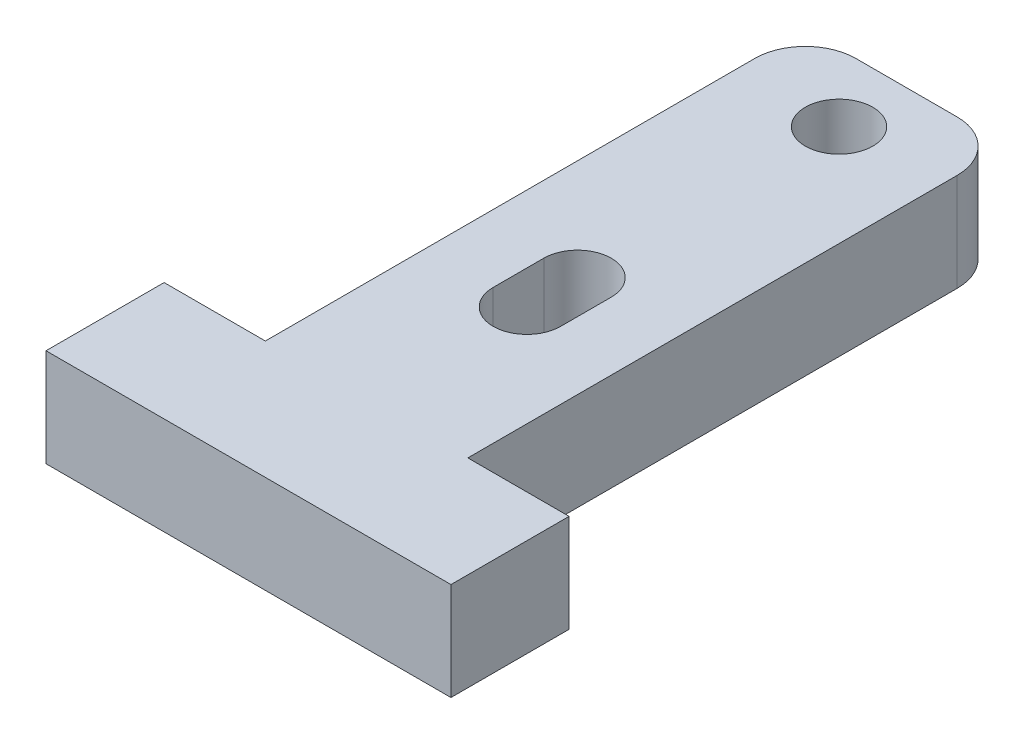
ISO-10303-21;
HEADER;
FILE_DESCRIPTION(('STEP AP214'),'2;1');
FILE_NAME('part.step','',(''),(''),'','','');
FILE_SCHEMA(('AUTOMOTIVE_DESIGN { 1 0 10303 214 1 1 1 1 }'));
ENDSEC;
DATA;
#1=APPLICATION_CONTEXT('core data for automotive mechanical design processes');
#2=APPLICATION_PROTOCOL_DEFINITION('international standard','automotive_design',2000,#1);
#3=PRODUCT_CONTEXT('',#1,'mechanical');
#4=PRODUCT('Part','Part','',(#3));
#5=PRODUCT_RELATED_PRODUCT_CATEGORY('part','',(#4));
#6=PRODUCT_DEFINITION_FORMATION('','',#4);
#7=PRODUCT_DEFINITION_CONTEXT('part definition',#1,'design');
#8=PRODUCT_DEFINITION('design','',#6,#7);
#9=PRODUCT_DEFINITION_SHAPE('','',#8);
#10=(LENGTH_UNIT() NAMED_UNIT(*) SI_UNIT(.MILLI.,.METRE.));
#11=(NAMED_UNIT(*) PLANE_ANGLE_UNIT() SI_UNIT($,.RADIAN.));
#12=(NAMED_UNIT(*) SI_UNIT($,.STERADIAN.) SOLID_ANGLE_UNIT());
#13=UNCERTAINTY_MEASURE_WITH_UNIT(LENGTH_MEASURE(1.E-05),#10,'distance_accuracy_value','');
#14=(GEOMETRIC_REPRESENTATION_CONTEXT(3) GLOBAL_UNCERTAINTY_ASSIGNED_CONTEXT((#13)) GLOBAL_UNIT_ASSIGNED_CONTEXT((#10,
#11,#12)) REPRESENTATION_CONTEXT('',''));
#15=CARTESIAN_POINT('',(0.,0.,0.));
#16=DIRECTION('',(0.,0.,1.));
#17=DIRECTION('',(1.,0.,0.));
#18=AXIS2_PLACEMENT_3D('',#15,#16,#17);
#19=CARTESIAN_POINT('',(-3.,5.8,-10.3755760873891));
#20=DIRECTION('',(0.,1.,0.));
#21=DIRECTION('',(0.,0.,1.));
#22=AXIS2_PLACEMENT_3D('',#19,#20,#21);
#23=PLANE('',#22);
#24=DIRECTION('',(0.,0.,-1.));
#25=VECTOR('',#24,1.);
#26=CARTESIAN_POINT('',(5.99999999999999,5.8,-10.3755760873891));
#27=LINE('',#26,#25);
#28=CARTESIAN_POINT('',(6.,5.8,18.6244239126108));
#29=VERTEX_POINT('',#28);
#30=CARTESIAN_POINT('',(5.99999999999999,5.8,-10.3755760873891));
#31=VERTEX_POINT('',#30);
#32=EDGE_CURVE('E181',#29,#31,#27,.T.);
#33=ORIENTED_EDGE('',*,*,#32,.T.);
#34=CARTESIAN_POINT('',(2.99999999999999,5.8,-10.3755760873891));
#35=DIRECTION('',(0.,1.,0.));
#36=DIRECTION('',(0.,0.,-1.));
#37=AXIS2_PLACEMENT_3D('',#34,#35,#36);
#38=CIRCLE('',#37,3.);
#39=CARTESIAN_POINT('',(2.99999999999999,5.8,-13.3755760873892));
#40=VERTEX_POINT('',#39);
#41=EDGE_CURVE('E184',#31,#40,#38,.T.);
#42=ORIENTED_EDGE('',*,*,#41,.T.);
#43=DIRECTION('',(-1.,0.,0.));
#44=VECTOR('',#43,1.);
#45=CARTESIAN_POINT('',(-3.,5.8,-13.3755760873891));
#46=LINE('',#45,#44);
#47=CARTESIAN_POINT('',(-3.,5.8,-13.3755760873891));
#48=VERTEX_POINT('',#47);
#49=EDGE_CURVE('E187',#40,#48,#46,.T.);
#50=ORIENTED_EDGE('',*,*,#49,.T.);
#51=CARTESIAN_POINT('',(-3.,5.8,-10.3755760873891));
#52=DIRECTION('',(0.,1.,0.));
#53=DIRECTION('',(0.,0.,1.));
#54=AXIS2_PLACEMENT_3D('',#51,#52,#53);
#55=CIRCLE('',#54,3.);
#56=CARTESIAN_POINT('',(-6.,5.8,-10.3755760873891));
#57=VERTEX_POINT('',#56);
#58=EDGE_CURVE('E189',#48,#57,#55,.T.);
#59=ORIENTED_EDGE('',*,*,#58,.T.);
#60=DIRECTION('',(0.,0.,1.));
#61=VECTOR('',#60,1.);
#62=CARTESIAN_POINT('',(-6.,5.8,-10.3755760873891));
#63=LINE('',#62,#61);
#64=CARTESIAN_POINT('',(-6.,5.8,18.6244239126108));
#65=VERTEX_POINT('',#64);
#66=EDGE_CURVE('E191',#57,#65,#63,.T.);
#67=ORIENTED_EDGE('',*,*,#66,.T.);
#68=DIRECTION('',(-1.,0.,0.));
#69=VECTOR('',#68,1.);
#70=CARTESIAN_POINT('',(-12.,5.8,18.6244239126108));
#71=LINE('',#70,#69);
#72=CARTESIAN_POINT('',(-12.,5.8,18.6244239126108));
#73=VERTEX_POINT('',#72);
#74=EDGE_CURVE('E193',#65,#73,#71,.T.);
#75=ORIENTED_EDGE('',*,*,#74,.T.);
#76=DIRECTION('',(0.,0.,1.));
#77=VECTOR('',#76,1.);
#78=CARTESIAN_POINT('',(-12.,5.8,18.6244239126108));
#79=LINE('',#78,#77);
#80=CARTESIAN_POINT('',(-12.,5.8,25.6244239126109));
#81=VERTEX_POINT('',#80);
#82=EDGE_CURVE('E195',#73,#81,#79,.T.);
#83=ORIENTED_EDGE('',*,*,#82,.T.);
#84=DIRECTION('',(1.,0.,0.));
#85=VECTOR('',#84,1.);
#86=CARTESIAN_POINT('',(-12.,5.8,25.6244239126109));
#87=LINE('',#86,#85);
#88=CARTESIAN_POINT('',(12.,5.8,25.6244239126108));
#89=VERTEX_POINT('',#88);
#90=EDGE_CURVE('E197',#81,#89,#87,.T.);
#91=ORIENTED_EDGE('',*,*,#90,.T.);
#92=DIRECTION('',(0.,0.,-1.));
#93=VECTOR('',#92,1.);
#94=CARTESIAN_POINT('',(12.,5.8,18.6244239126108));
#95=LINE('',#94,#93);
#96=CARTESIAN_POINT('',(12.,5.8,18.6244239126108));
#97=VERTEX_POINT('',#96);
#98=EDGE_CURVE('E199',#89,#97,#95,.T.);
#99=ORIENTED_EDGE('',*,*,#98,.T.);
#100=DIRECTION('',(-1.,0.,0.));
#101=VECTOR('',#100,1.);
#102=CARTESIAN_POINT('',(6.,5.8,18.6244239126108));
#103=LINE('',#102,#101);
#104=EDGE_CURVE('E201',#97,#29,#103,.T.);
#105=ORIENTED_EDGE('',*,*,#104,.T.);
#106=EDGE_LOOP('',(#33,#42,#50,#59,#67,#75,#83,#91,#99,#105));
#107=FACE_BOUND('',#106,.T.);
#108=CARTESIAN_POINT('',(0.,5.8,-9.37557608738915));
#109=DIRECTION('',(0.,1.,0.));
#110=DIRECTION('',(0.,0.,1.));
#111=AXIS2_PLACEMENT_3D('',#108,#109,#110);
#112=CIRCLE('',#111,2.);
#113=CARTESIAN_POINT('',(0.,5.8,-7.37557608738915));
#114=VERTEX_POINT('',#113);
#115=EDGE_CURVE('E175',#114,#114,#112,.T.);
#116=ORIENTED_EDGE('',*,*,#115,.F.);
#117=EDGE_LOOP('',(#116));
#118=FACE_BOUND('',#117,.T.);
#119=DIRECTION('',(0.,0.,-1.));
#120=VECTOR('',#119,1.);
#121=CARTESIAN_POINT('',(2.,5.8,9.12442391261085));
#122=LINE('',#121,#120);
#123=CARTESIAN_POINT('',(2.,5.8,9.12442391261085));
#124=VERTEX_POINT('',#123);
#125=CARTESIAN_POINT('',(2.,5.8,6.12442391261085));
#126=VERTEX_POINT('',#125);
#127=EDGE_CURVE('E147',#124,#126,#122,.T.);
#128=ORIENTED_EDGE('',*,*,#127,.F.);
#129=CARTESIAN_POINT('',(0.,5.8,9.12442391261085));
#130=DIRECTION('',(0.,1.,0.));
#131=DIRECTION('',(0.,0.,1.));
#132=AXIS2_PLACEMENT_3D('',#129,#130,#131);
#133=CIRCLE('',#132,2.);
#134=CARTESIAN_POINT('',(-2.,5.8,9.12442391261085));
#135=VERTEX_POINT('',#134);
#136=EDGE_CURVE('E139',#135,#124,#133,.T.);
#137=ORIENTED_EDGE('',*,*,#136,.F.);
#138=DIRECTION('',(0.,0.,1.));
#139=VECTOR('',#138,1.);
#140=CARTESIAN_POINT('',(-2.,5.8,9.12442391261085));
#141=LINE('',#140,#139);
#142=CARTESIAN_POINT('',(-2.,5.8,6.12442391261085));
#143=VERTEX_POINT('',#142);
#144=EDGE_CURVE('E161',#143,#135,#141,.T.);
#145=ORIENTED_EDGE('',*,*,#144,.F.);
#146=CARTESIAN_POINT('',(0.,5.8,6.12442391261085));
#147=DIRECTION('',(0.,1.,0.));
#148=DIRECTION('',(0.,0.,1.));
#149=AXIS2_PLACEMENT_3D('',#146,#147,#148);
#150=CIRCLE('',#149,2.);
#151=EDGE_CURVE('E159',#126,#143,#150,.T.);
#152=ORIENTED_EDGE('',*,*,#151,.F.);
#153=EDGE_LOOP('',(#128,#137,#145,#152));
#154=FACE_BOUND('',#153,.T.);
#155=ADVANCED_FACE('F38',(#107,#118,#154),#23,.T.);
#156=CARTESIAN_POINT('',(-3.,0.,-10.3755760873891));
#157=DIRECTION('',(0.,1.,0.));
#158=DIRECTION('',(0.,0.,1.));
#159=AXIS2_PLACEMENT_3D('',#156,#157,#158);
#160=PLANE('',#159);
#161=CARTESIAN_POINT('',(0.,0.,-9.37557608738915));
#162=DIRECTION('',(0.,1.,0.));
#163=DIRECTION('',(0.,0.,1.));
#164=AXIS2_PLACEMENT_3D('',#161,#162,#163);
#165=CIRCLE('',#164,2.);
#166=CARTESIAN_POINT('',(0.,0.,-7.37557608738915));
#167=VERTEX_POINT('',#166);
#168=EDGE_CURVE('E155',#167,#167,#165,.T.);
#169=ORIENTED_EDGE('',*,*,#168,.T.);
#170=EDGE_LOOP('',(#169));
#171=FACE_BOUND('',#170,.T.);
#172=DIRECTION('',(0.,0.,-1.));
#173=VECTOR('',#172,1.);
#174=CARTESIAN_POINT('',(5.99999999999999,0.,-10.3755760873891));
#175=LINE('',#174,#173);
#176=CARTESIAN_POINT('',(6.,0.,18.6244239126108));
#177=VERTEX_POINT('',#176);
#178=CARTESIAN_POINT('',(5.99999999999999,0.,-10.3755760873891));
#179=VERTEX_POINT('',#178);
#180=EDGE_CURVE('E178',#177,#179,#175,.T.);
#181=ORIENTED_EDGE('',*,*,#180,.F.);
#182=DIRECTION('',(-1.,0.,0.));
#183=VECTOR('',#182,1.);
#184=CARTESIAN_POINT('',(6.,0.,18.6244239126108));
#185=LINE('',#184,#183);
#186=CARTESIAN_POINT('',(12.,0.,18.6244239126108));
#187=VERTEX_POINT('',#186);
#188=EDGE_CURVE('E185',#187,#177,#185,.T.);
#189=ORIENTED_EDGE('',*,*,#188,.F.);
#190=DIRECTION('',(0.,0.,-1.));
#191=VECTOR('',#190,1.);
#192=CARTESIAN_POINT('',(12.,0.,18.6244239126108));
#193=LINE('',#192,#191);
#194=CARTESIAN_POINT('',(12.,0.,25.6244239126108));
#195=VERTEX_POINT('',#194);
#196=EDGE_CURVE('E220',#195,#187,#193,.T.);
#197=ORIENTED_EDGE('',*,*,#196,.F.);
#198=DIRECTION('',(1.,0.,0.));
#199=VECTOR('',#198,1.);
#200=CARTESIAN_POINT('',(-12.,0.,25.6244239126109));
#201=LINE('',#200,#199);
#202=CARTESIAN_POINT('',(-12.,0.,25.6244239126109));
#203=VERTEX_POINT('',#202);
#204=EDGE_CURVE('E218',#203,#195,#201,.T.);
#205=ORIENTED_EDGE('',*,*,#204,.F.);
#206=DIRECTION('',(0.,0.,1.));
#207=VECTOR('',#206,1.);
#208=CARTESIAN_POINT('',(-12.,0.,18.6244239126108));
#209=LINE('',#208,#207);
#210=CARTESIAN_POINT('',(-12.,0.,18.6244239126108));
#211=VERTEX_POINT('',#210);
#212=EDGE_CURVE('E216',#211,#203,#209,.T.);
#213=ORIENTED_EDGE('',*,*,#212,.F.);
#214=DIRECTION('',(-1.,0.,0.));
#215=VECTOR('',#214,1.);
#216=CARTESIAN_POINT('',(-12.,0.,18.6244239126108));
#217=LINE('',#216,#215);
#218=CARTESIAN_POINT('',(-6.,0.,18.6244239126108));
#219=VERTEX_POINT('',#218);
#220=EDGE_CURVE('E214',#219,#211,#217,.T.);
#221=ORIENTED_EDGE('',*,*,#220,.F.);
#222=DIRECTION('',(0.,0.,1.));
#223=VECTOR('',#222,1.);
#224=CARTESIAN_POINT('',(-6.,0.,-10.3755760873891));
#225=LINE('',#224,#223);
#226=CARTESIAN_POINT('',(-6.,0.,-10.3755760873891));
#227=VERTEX_POINT('',#226);
#228=EDGE_CURVE('E212',#227,#219,#225,.T.);
#229=ORIENTED_EDGE('',*,*,#228,.F.);
#230=CARTESIAN_POINT('',(-3.,0.,-10.3755760873891));
#231=DIRECTION('',(0.,1.,0.));
#232=DIRECTION('',(0.,0.,1.));
#233=AXIS2_PLACEMENT_3D('',#230,#231,#232);
#234=CIRCLE('',#233,3.);
#235=CARTESIAN_POINT('',(-3.,0.,-13.3755760873891));
#236=VERTEX_POINT('',#235);
#237=EDGE_CURVE('E210',#236,#227,#234,.T.);
#238=ORIENTED_EDGE('',*,*,#237,.F.);
#239=DIRECTION('',(-1.,0.,0.));
#240=VECTOR('',#239,1.);
#241=CARTESIAN_POINT('',(-3.,0.,-13.3755760873891));
#242=LINE('',#241,#240);
#243=CARTESIAN_POINT('',(2.99999999999999,0.,-13.3755760873892));
#244=VERTEX_POINT('',#243);
#245=EDGE_CURVE('E208',#244,#236,#242,.T.);
#246=ORIENTED_EDGE('',*,*,#245,.F.);
#247=CARTESIAN_POINT('',(2.99999999999999,0.,-10.3755760873891));
#248=DIRECTION('',(0.,1.,0.));
#249=DIRECTION('',(0.,0.,-1.));
#250=AXIS2_PLACEMENT_3D('',#247,#248,#249);
#251=CIRCLE('',#250,3.);
#252=EDGE_CURVE('E206',#179,#244,#251,.T.);
#253=ORIENTED_EDGE('',*,*,#252,.F.);
#254=EDGE_LOOP('',(#181,#189,#197,#205,#213,#221,#229,#238,#246,#253));
#255=FACE_BOUND('',#254,.T.);
#256=CARTESIAN_POINT('',(0.,0.,9.12442391261085));
#257=DIRECTION('',(0.,1.,0.));
#258=DIRECTION('',(0.,0.,1.));
#259=AXIS2_PLACEMENT_3D('',#256,#257,#258);
#260=CIRCLE('',#259,2.);
#261=CARTESIAN_POINT('',(-2.,0.,9.12442391261085));
#262=VERTEX_POINT('',#261);
#263=CARTESIAN_POINT('',(2.,0.,9.12442391261085));
#264=VERTEX_POINT('',#263);
#265=EDGE_CURVE('E61',#262,#264,#260,.T.);
#266=ORIENTED_EDGE('',*,*,#265,.T.);
#267=DIRECTION('',(0.,0.,-1.));
#268=VECTOR('',#267,1.);
#269=CARTESIAN_POINT('',(2.,0.,9.12442391261085));
#270=LINE('',#269,#268);
#271=CARTESIAN_POINT('',(2.,0.,6.12442391261085));
#272=VERTEX_POINT('',#271);
#273=EDGE_CURVE('E154',#264,#272,#270,.T.);
#274=ORIENTED_EDGE('',*,*,#273,.T.);
#275=CARTESIAN_POINT('',(0.,0.,6.12442391261085));
#276=DIRECTION('',(0.,1.,0.));
#277=DIRECTION('',(0.,0.,1.));
#278=AXIS2_PLACEMENT_3D('',#275,#276,#277);
#279=CIRCLE('',#278,2.);
#280=CARTESIAN_POINT('',(-2.,0.,6.12442391261085));
#281=VERTEX_POINT('',#280);
#282=EDGE_CURVE('E167',#272,#281,#279,.T.);
#283=ORIENTED_EDGE('',*,*,#282,.T.);
#284=DIRECTION('',(0.,0.,1.));
#285=VECTOR('',#284,1.);
#286=CARTESIAN_POINT('',(-2.,0.,9.12442391261085));
#287=LINE('',#286,#285);
#288=EDGE_CURVE('E148',#281,#262,#287,.T.);
#289=ORIENTED_EDGE('',*,*,#288,.T.);
#290=EDGE_LOOP('',(#266,#274,#283,#289));
#291=FACE_BOUND('',#290,.T.);
#292=ADVANCED_FACE('F256',(#171,#255,#291),#160,.F.);
#293=CARTESIAN_POINT('',(5.99999999999999,5.8,-10.3755760873891));
#294=DIRECTION('',(-1.,0.,0.));
#295=DIRECTION('',(0.,0.,1.));
#296=AXIS2_PLACEMENT_3D('',#293,#294,#295);
#297=PLANE('',#296);
#298=ORIENTED_EDGE('',*,*,#180,.T.);
#299=DIRECTION('',(0.,-1.,0.));
#300=VECTOR('',#299,1.);
#301=CARTESIAN_POINT('',(5.99999999999999,5.8,-10.3755760873891));
#302=LINE('',#301,#300);
#303=EDGE_CURVE('E11',#31,#179,#302,.T.);
#304=ORIENTED_EDGE('',*,*,#303,.F.);
#305=ORIENTED_EDGE('',*,*,#32,.F.);
#306=DIRECTION('',(0.,-1.,0.));
#307=VECTOR('',#306,1.);
#308=CARTESIAN_POINT('',(6.,5.8,18.6244239126108));
#309=LINE('',#308,#307);
#310=EDGE_CURVE('E203',#29,#177,#309,.T.);
#311=ORIENTED_EDGE('',*,*,#310,.T.);
#312=EDGE_LOOP('',(#298,#304,#305,#311));
#313=FACE_BOUND('',#312,.T.);
#314=ADVANCED_FACE('F40',(#313),#297,.F.);
#315=CARTESIAN_POINT('',(2.99999999999999,5.8,-10.3755760873891));
#316=DIRECTION('',(0.,-1.,0.));
#317=DIRECTION('',(0.,0.,-1.));
#318=AXIS2_PLACEMENT_3D('',#315,#316,#317);
#319=CYLINDRICAL_SURFACE('',#318,3.);
#320=ORIENTED_EDGE('',*,*,#252,.T.);
#321=DIRECTION('',(0.,-1.,0.));
#322=VECTOR('',#321,1.);
#323=CARTESIAN_POINT('',(2.99999999999999,5.8,-13.3755760873892));
#324=LINE('',#323,#322);
#325=EDGE_CURVE('E46',#40,#244,#324,.T.);
#326=ORIENTED_EDGE('',*,*,#325,.F.);
#327=ORIENTED_EDGE('',*,*,#41,.F.);
#328=ORIENTED_EDGE('',*,*,#303,.T.);
#329=EDGE_LOOP('',(#320,#326,#327,#328));
#330=FACE_BOUND('',#329,.T.);
#331=ADVANCED_FACE('F274',(#330),#319,.T.);
#332=CARTESIAN_POINT('',(-3.,5.8,-13.3755760873891));
#333=DIRECTION('',(0.,0.,1.));
#334=DIRECTION('',(1.,0.,0.));
#335=AXIS2_PLACEMENT_3D('',#332,#333,#334);
#336=PLANE('',#335);
#337=ORIENTED_EDGE('',*,*,#245,.T.);
#338=DIRECTION('',(0.,-1.,0.));
#339=VECTOR('',#338,1.);
#340=CARTESIAN_POINT('',(-3.,5.8,-13.3755760873891));
#341=LINE('',#340,#339);
#342=EDGE_CURVE('E243',#48,#236,#341,.T.);
#343=ORIENTED_EDGE('',*,*,#342,.F.);
#344=ORIENTED_EDGE('',*,*,#49,.F.);
#345=ORIENTED_EDGE('',*,*,#325,.T.);
#346=EDGE_LOOP('',(#337,#343,#344,#345));
#347=FACE_BOUND('',#346,.T.);
#348=ADVANCED_FACE('F250',(#347),#336,.F.);
#349=CARTESIAN_POINT('',(-3.,5.8,-10.3755760873891));
#350=DIRECTION('',(0.,-1.,0.));
#351=DIRECTION('',(0.,0.,-1.));
#352=AXIS2_PLACEMENT_3D('',#349,#350,#351);
#353=CYLINDRICAL_SURFACE('',#352,3.);
#354=ORIENTED_EDGE('',*,*,#237,.T.);
#355=DIRECTION('',(0.,-1.,0.));
#356=VECTOR('',#355,1.);
#357=CARTESIAN_POINT('',(-6.,5.8,-10.3755760873891));
#358=LINE('',#357,#356);
#359=EDGE_CURVE('E240',#57,#227,#358,.T.);
#360=ORIENTED_EDGE('',*,*,#359,.F.);
#361=ORIENTED_EDGE('',*,*,#58,.F.);
#362=ORIENTED_EDGE('',*,*,#342,.T.);
#363=EDGE_LOOP('',(#354,#360,#361,#362));
#364=FACE_BOUND('',#363,.T.);
#365=ADVANCED_FACE('F262',(#364),#353,.T.);
#366=CARTESIAN_POINT('',(-6.,5.8,-10.3755760873891));
#367=DIRECTION('',(1.,0.,0.));
#368=DIRECTION('',(0.,0.,-1.));
#369=AXIS2_PLACEMENT_3D('',#366,#367,#368);
#370=PLANE('',#369);
#371=ORIENTED_EDGE('',*,*,#228,.T.);
#372=DIRECTION('',(0.,-1.,0.));
#373=VECTOR('',#372,1.);
#374=CARTESIAN_POINT('',(-6.,5.8,18.6244239126108));
#375=LINE('',#374,#373);
#376=EDGE_CURVE('E237',#65,#219,#375,.T.);
#377=ORIENTED_EDGE('',*,*,#376,.F.);
#378=ORIENTED_EDGE('',*,*,#66,.F.);
#379=ORIENTED_EDGE('',*,*,#359,.T.);
#380=EDGE_LOOP('',(#371,#377,#378,#379));
#381=FACE_BOUND('',#380,.T.);
#382=ADVANCED_FACE('F266',(#381),#370,.F.);
#383=CARTESIAN_POINT('',(-12.,5.8,18.6244239126108));
#384=DIRECTION('',(0.,0.,1.));
#385=DIRECTION('',(1.,0.,0.));
#386=AXIS2_PLACEMENT_3D('',#383,#384,#385);
#387=PLANE('',#386);
#388=ORIENTED_EDGE('',*,*,#220,.T.);
#389=DIRECTION('',(0.,-1.,0.));
#390=VECTOR('',#389,1.);
#391=CARTESIAN_POINT('',(-12.,5.8,18.6244239126108));
#392=LINE('',#391,#390);
#393=EDGE_CURVE('E234',#73,#211,#392,.T.);
#394=ORIENTED_EDGE('',*,*,#393,.F.);
#395=ORIENTED_EDGE('',*,*,#74,.F.);
#396=ORIENTED_EDGE('',*,*,#376,.T.);
#397=EDGE_LOOP('',(#388,#394,#395,#396));
#398=FACE_BOUND('',#397,.T.);
#399=ADVANCED_FACE('F297',(#398),#387,.F.);
#400=CARTESIAN_POINT('',(-12.,5.8,18.6244239126108));
#401=DIRECTION('',(1.,0.,0.));
#402=DIRECTION('',(0.,0.,-1.));
#403=AXIS2_PLACEMENT_3D('',#400,#401,#402);
#404=PLANE('',#403);
#405=ORIENTED_EDGE('',*,*,#212,.T.);
#406=DIRECTION('',(0.,-1.,0.));
#407=VECTOR('',#406,1.);
#408=CARTESIAN_POINT('',(-12.,5.8,25.6244239126109));
#409=LINE('',#408,#407);
#410=EDGE_CURVE('E231',#81,#203,#409,.T.);
#411=ORIENTED_EDGE('',*,*,#410,.F.);
#412=ORIENTED_EDGE('',*,*,#82,.F.);
#413=ORIENTED_EDGE('',*,*,#393,.T.);
#414=EDGE_LOOP('',(#405,#411,#412,#413));
#415=FACE_BOUND('',#414,.T.);
#416=ADVANCED_FACE('F294',(#415),#404,.F.);
#417=CARTESIAN_POINT('',(-12.,5.8,25.6244239126109));
#418=DIRECTION('',(0.,0.,-1.));
#419=DIRECTION('',(-1.,0.,0.));
#420=AXIS2_PLACEMENT_3D('',#417,#418,#419);
#421=PLANE('',#420);
#422=ORIENTED_EDGE('',*,*,#204,.T.);
#423=DIRECTION('',(0.,-1.,0.));
#424=VECTOR('',#423,1.);
#425=CARTESIAN_POINT('',(12.,5.8,25.6244239126108));
#426=LINE('',#425,#424);
#427=EDGE_CURVE('E228',#89,#195,#426,.T.);
#428=ORIENTED_EDGE('',*,*,#427,.F.);
#429=ORIENTED_EDGE('',*,*,#90,.F.);
#430=ORIENTED_EDGE('',*,*,#410,.T.);
#431=EDGE_LOOP('',(#422,#428,#429,#430));
#432=FACE_BOUND('',#431,.T.);
#433=ADVANCED_FACE('F290',(#432),#421,.F.);
#434=CARTESIAN_POINT('',(12.,5.8,18.6244239126108));
#435=DIRECTION('',(-1.,0.,0.));
#436=DIRECTION('',(0.,0.,1.));
#437=AXIS2_PLACEMENT_3D('',#434,#435,#436);
#438=PLANE('',#437);
#439=ORIENTED_EDGE('',*,*,#196,.T.);
#440=DIRECTION('',(0.,-1.,0.));
#441=VECTOR('',#440,1.);
#442=CARTESIAN_POINT('',(12.,5.8,18.6244239126108));
#443=LINE('',#442,#441);
#444=EDGE_CURVE('E225',#97,#187,#443,.T.);
#445=ORIENTED_EDGE('',*,*,#444,.F.);
#446=ORIENTED_EDGE('',*,*,#98,.F.);
#447=ORIENTED_EDGE('',*,*,#427,.T.);
#448=EDGE_LOOP('',(#439,#445,#446,#447));
#449=FACE_BOUND('',#448,.T.);
#450=ADVANCED_FACE('F286',(#449),#438,.F.);
#451=CARTESIAN_POINT('',(6.,5.8,18.6244239126108));
#452=DIRECTION('',(0.,0.,1.));
#453=DIRECTION('',(1.,0.,0.));
#454=AXIS2_PLACEMENT_3D('',#451,#452,#453);
#455=PLANE('',#454);
#456=ORIENTED_EDGE('',*,*,#188,.T.);
#457=ORIENTED_EDGE('',*,*,#310,.F.);
#458=ORIENTED_EDGE('',*,*,#104,.F.);
#459=ORIENTED_EDGE('',*,*,#444,.T.);
#460=EDGE_LOOP('',(#456,#457,#458,#459));
#461=FACE_BOUND('',#460,.T.);
#462=ADVANCED_FACE('F281',(#461),#455,.F.);
#463=CARTESIAN_POINT('',(0.,5.8,-9.37557608738915));
#464=DIRECTION('',(0.,-1.,0.));
#465=DIRECTION('',(0.,0.,-1.));
#466=AXIS2_PLACEMENT_3D('',#463,#464,#465);
#467=CYLINDRICAL_SURFACE('',#466,2.);
#468=ORIENTED_EDGE('',*,*,#115,.T.);
#469=EDGE_LOOP('',(#468));
#470=FACE_BOUND('',#469,.T.);
#471=ORIENTED_EDGE('',*,*,#168,.F.);
#472=EDGE_LOOP('',(#471));
#473=FACE_BOUND('',#472,.T.);
#474=ADVANCED_FACE('F314',(#470,#473),#467,.F.);
#475=CARTESIAN_POINT('',(0.,5.8,9.12442391261085));
#476=DIRECTION('',(0.,-1.,0.));
#477=DIRECTION('',(0.,0.,-1.));
#478=AXIS2_PLACEMENT_3D('',#475,#476,#477);
#479=CYLINDRICAL_SURFACE('',#478,2.);
#480=ORIENTED_EDGE('',*,*,#265,.F.);
#481=DIRECTION('',(0.,-1.,0.));
#482=VECTOR('',#481,1.);
#483=CARTESIAN_POINT('',(-2.,5.8,9.12442391261085));
#484=LINE('',#483,#482);
#485=EDGE_CURVE('E143',#135,#262,#484,.T.);
#486=ORIENTED_EDGE('',*,*,#485,.F.);
#487=ORIENTED_EDGE('',*,*,#136,.T.);
#488=DIRECTION('',(0.,-1.,0.));
#489=VECTOR('',#488,1.);
#490=CARTESIAN_POINT('',(2.,5.8,9.12442391261085));
#491=LINE('',#490,#489);
#492=EDGE_CURVE('E142',#124,#264,#491,.T.);
#493=ORIENTED_EDGE('',*,*,#492,.T.);
#494=EDGE_LOOP('',(#480,#486,#487,#493));
#495=FACE_BOUND('',#494,.T.);
#496=ADVANCED_FACE('F141',(#495),#479,.F.);
#497=CARTESIAN_POINT('',(2.,5.8,9.12442391261085));
#498=DIRECTION('',(-1.,0.,0.));
#499=DIRECTION('',(0.,0.,1.));
#500=AXIS2_PLACEMENT_3D('',#497,#498,#499);
#501=PLANE('',#500);
#502=ORIENTED_EDGE('',*,*,#273,.F.);
#503=ORIENTED_EDGE('',*,*,#492,.F.);
#504=ORIENTED_EDGE('',*,*,#127,.T.);
#505=DIRECTION('',(0.,-1.,0.));
#506=VECTOR('',#505,1.);
#507=CARTESIAN_POINT('',(2.,5.8,6.12442391261085));
#508=LINE('',#507,#506);
#509=EDGE_CURVE('E156',#126,#272,#508,.T.);
#510=ORIENTED_EDGE('',*,*,#509,.T.);
#511=EDGE_LOOP('',(#502,#503,#504,#510));
#512=FACE_BOUND('',#511,.T.);
#513=ADVANCED_FACE('F151',(#512),#501,.T.);
#514=CARTESIAN_POINT('',(0.,5.8,6.12442391261085));
#515=DIRECTION('',(0.,-1.,0.));
#516=DIRECTION('',(0.,0.,-1.));
#517=AXIS2_PLACEMENT_3D('',#514,#515,#516);
#518=CYLINDRICAL_SURFACE('',#517,2.);
#519=ORIENTED_EDGE('',*,*,#282,.F.);
#520=ORIENTED_EDGE('',*,*,#509,.F.);
#521=ORIENTED_EDGE('',*,*,#151,.T.);
#522=DIRECTION('',(0.,-1.,0.));
#523=VECTOR('',#522,1.);
#524=CARTESIAN_POINT('',(-2.,5.8,6.12442391261085));
#525=LINE('',#524,#523);
#526=EDGE_CURVE('E53',#143,#281,#525,.T.);
#527=ORIENTED_EDGE('',*,*,#526,.T.);
#528=EDGE_LOOP('',(#519,#520,#521,#527));
#529=FACE_BOUND('',#528,.T.);
#530=ADVANCED_FACE('F351',(#529),#518,.F.);
#531=CARTESIAN_POINT('',(-2.,5.8,9.12442391261085));
#532=DIRECTION('',(1.,0.,0.));
#533=DIRECTION('',(0.,0.,-1.));
#534=AXIS2_PLACEMENT_3D('',#531,#532,#533);
#535=PLANE('',#534);
#536=ORIENTED_EDGE('',*,*,#288,.F.);
#537=ORIENTED_EDGE('',*,*,#526,.F.);
#538=ORIENTED_EDGE('',*,*,#144,.T.);
#539=ORIENTED_EDGE('',*,*,#485,.T.);
#540=EDGE_LOOP('',(#536,#537,#538,#539));
#541=FACE_BOUND('',#540,.T.);
#542=ADVANCED_FACE('F358',(#541),#535,.T.);
#543=CLOSED_SHELL('',(#155,#292,#314,#331,#348,#365,#382,#399,#416,#433,#450,#462,#474,#496,
#513,#530,#542));
#544=MANIFOLD_SOLID_BREP('B2',#543);
#545=ADVANCED_BREP_SHAPE_REPRESENTATION('',(#18,#544),#14);
#546=SHAPE_DEFINITION_REPRESENTATION(#9,#545);
ENDSEC;
END-ISO-10303-21;
